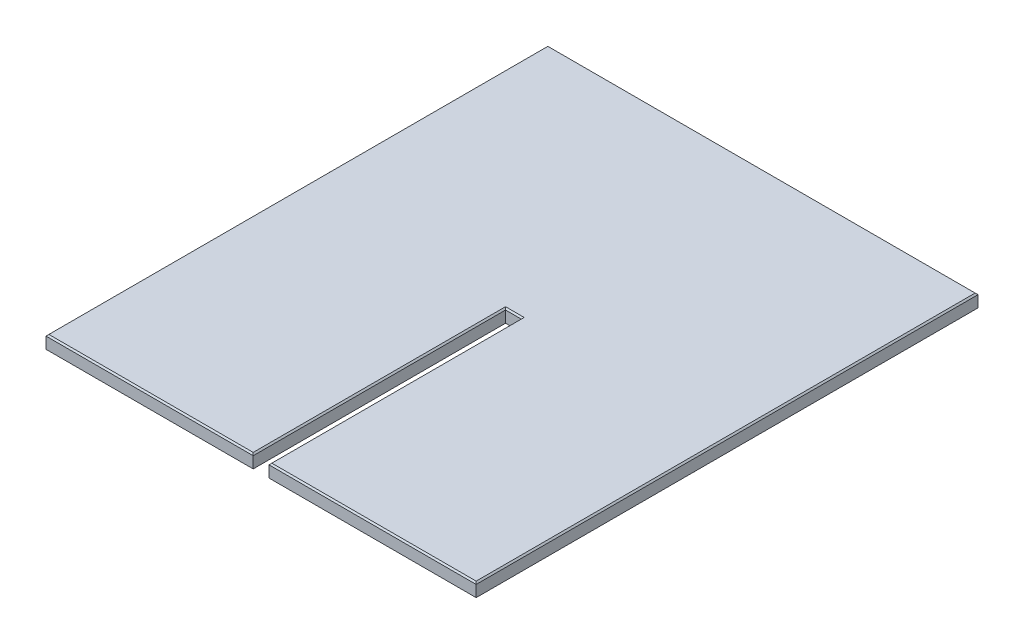
ISO-10303-21;
HEADER;
FILE_DESCRIPTION(('STEP AP214'),'2;1');
FILE_NAME('part.step','',(''),(''),'','','');
FILE_SCHEMA(('AUTOMOTIVE_DESIGN { 1 0 10303 214 1 1 1 1 }'));
ENDSEC;
DATA;
#1=APPLICATION_CONTEXT('core data for automotive mechanical design processes');
#2=APPLICATION_PROTOCOL_DEFINITION('international standard','automotive_design',2000,#1);
#3=PRODUCT_CONTEXT('',#1,'mechanical');
#4=PRODUCT('Part','Part','',(#3));
#5=PRODUCT_RELATED_PRODUCT_CATEGORY('part','',(#4));
#6=PRODUCT_DEFINITION_FORMATION('','',#4);
#7=PRODUCT_DEFINITION_CONTEXT('part definition',#1,'design');
#8=PRODUCT_DEFINITION('design','',#6,#7);
#9=PRODUCT_DEFINITION_SHAPE('','',#8);
#10=(LENGTH_UNIT() NAMED_UNIT(*) SI_UNIT(.MILLI.,.METRE.));
#11=(NAMED_UNIT(*) PLANE_ANGLE_UNIT() SI_UNIT($,.RADIAN.));
#12=(NAMED_UNIT(*) SI_UNIT($,.STERADIAN.) SOLID_ANGLE_UNIT());
#13=UNCERTAINTY_MEASURE_WITH_UNIT(LENGTH_MEASURE(1.E-05),#10,'distance_accuracy_value','');
#14=(GEOMETRIC_REPRESENTATION_CONTEXT(3) GLOBAL_UNCERTAINTY_ASSIGNED_CONTEXT((#13)) GLOBAL_UNIT_ASSIGNED_CONTEXT((#10,
#11,#12)) REPRESENTATION_CONTEXT('',''));
#15=CARTESIAN_POINT('',(0.,0.,0.));
#16=DIRECTION('',(0.,0.,1.));
#17=DIRECTION('',(1.,0.,0.));
#18=AXIS2_PLACEMENT_3D('',#15,#16,#17);
#19=CARTESIAN_POINT('',(-38.1,1.27,44.45));
#20=DIRECTION('',(0.,0.,-1.));
#21=DIRECTION('',(-1.,0.,0.));
#22=AXIS2_PLACEMENT_3D('',#19,#20,#21);
#23=PLANE('',#22);
#24=DIRECTION('',(0.,-1.,0.));
#25=VECTOR('',#24,1.);
#26=CARTESIAN_POINT('',(-38.1,1.27,44.45));
#27=LINE('',#26,#25);
#28=CARTESIAN_POINT('',(-38.1,1.01599999999998,44.45));
#29=VERTEX_POINT('',#28);
#30=CARTESIAN_POINT('',(-38.1,-1.01600000000001,44.45));
#31=VERTEX_POINT('',#30);
#32=EDGE_CURVE('E169',#29,#31,#27,.T.);
#33=ORIENTED_EDGE('',*,*,#32,.T.);
#34=DIRECTION('',(1.,0.,0.));
#35=VECTOR('',#34,1.);
#36=CARTESIAN_POINT('',(-1.39699999999999,-1.01600000000001,44.45));
#37=LINE('',#36,#35);
#38=CARTESIAN_POINT('',(-1.39699999999999,-1.01600000000001,44.45));
#39=VERTEX_POINT('',#38);
#40=EDGE_CURVE('E282',#31,#39,#37,.T.);
#41=ORIENTED_EDGE('',*,*,#40,.T.);
#42=DIRECTION('',(0.,-1.,0.));
#43=VECTOR('',#42,1.);
#44=CARTESIAN_POINT('',(-1.39699999999999,1.270012,44.45));
#45=LINE('',#44,#43);
#46=CARTESIAN_POINT('',(-1.39699999999999,1.01599999999998,44.45));
#47=VERTEX_POINT('',#46);
#48=EDGE_CURVE('E287',#47,#39,#45,.T.);
#49=ORIENTED_EDGE('',*,*,#48,.F.);
#50=DIRECTION('',(-1.,0.,0.));
#51=VECTOR('',#50,1.);
#52=CARTESIAN_POINT('',(-38.1,1.01599999999998,44.45));
#53=LINE('',#52,#51);
#54=EDGE_CURVE('E279',#47,#29,#53,.T.);
#55=ORIENTED_EDGE('',*,*,#54,.T.);
#56=EDGE_LOOP('',(#33,#41,#49,#55));
#57=FACE_BOUND('',#56,.T.);
#58=ADVANCED_FACE('F41',(#57),#23,.F.);
#59=CARTESIAN_POINT('',(0.,1.27,0.));
#60=DIRECTION('',(0.,-1.,0.));
#61=DIRECTION('',(0.,0.,-1.));
#62=AXIS2_PLACEMENT_3D('',#59,#60,#61);
#63=PLANE('',#62);
#64=DIRECTION('',(0.,0.,1.));
#65=VECTOR('',#64,1.);
#66=CARTESIAN_POINT('',(-37.846,1.27,0.));
#67=LINE('',#66,#65);
#68=CARTESIAN_POINT('',(-37.846,1.27,-44.196));
#69=VERTEX_POINT('',#68);
#70=CARTESIAN_POINT('',(-37.846,1.27,44.196));
#71=VERTEX_POINT('',#70);
#72=EDGE_CURVE('E51',#69,#71,#67,.T.);
#73=ORIENTED_EDGE('',*,*,#72,.T.);
#74=DIRECTION('',(1.,0.,0.));
#75=VECTOR('',#74,1.);
#76=CARTESIAN_POINT('',(0.,1.27,44.196));
#77=LINE('',#76,#75);
#78=CARTESIAN_POINT('',(-1.651,1.27,44.196));
#79=VERTEX_POINT('',#78);
#80=EDGE_CURVE('E11',#71,#79,#77,.T.);
#81=ORIENTED_EDGE('',*,*,#80,.T.);
#82=DIRECTION('',(0.,0.,-1.));
#83=VECTOR('',#82,1.);
#84=CARTESIAN_POINT('',(-1.651,1.27,-0.254));
#85=LINE('',#84,#83);
#86=CARTESIAN_POINT('',(-1.651,1.27,-0.508000000000004));
#87=VERTEX_POINT('',#86);
#88=EDGE_CURVE('E198',#79,#87,#85,.T.);
#89=ORIENTED_EDGE('',*,*,#88,.T.);
#90=DIRECTION('',(1.,0.,0.));
#91=VECTOR('',#90,1.);
#92=CARTESIAN_POINT('',(0.,1.27,-0.508000000000004));
#93=LINE('',#92,#91);
#94=CARTESIAN_POINT('',(1.651,1.27,-0.508000000000004));
#95=VERTEX_POINT('',#94);
#96=EDGE_CURVE('E205',#87,#95,#93,.T.);
#97=ORIENTED_EDGE('',*,*,#96,.T.);
#98=DIRECTION('',(0.,0.,1.));
#99=VECTOR('',#98,1.);
#100=CARTESIAN_POINT('',(1.651,1.27,0.));
#101=LINE('',#100,#99);
#102=CARTESIAN_POINT('',(1.65100000000001,1.27,44.196));
#103=VERTEX_POINT('',#102);
#104=EDGE_CURVE('E185',#95,#103,#101,.T.);
#105=ORIENTED_EDGE('',*,*,#104,.T.);
#106=DIRECTION('',(1.,0.,0.));
#107=VECTOR('',#106,1.);
#108=CARTESIAN_POINT('',(0.,1.27,44.196));
#109=LINE('',#108,#107);
#110=CARTESIAN_POINT('',(37.846,1.27,44.196));
#111=VERTEX_POINT('',#110);
#112=EDGE_CURVE('E208',#103,#111,#109,.T.);
#113=ORIENTED_EDGE('',*,*,#112,.T.);
#114=DIRECTION('',(0.,0.,-1.));
#115=VECTOR('',#114,1.);
#116=CARTESIAN_POINT('',(37.846,1.27,0.));
#117=LINE('',#116,#115);
#118=CARTESIAN_POINT('',(37.846,1.27,-44.196));
#119=VERTEX_POINT('',#118);
#120=EDGE_CURVE('E210',#111,#119,#117,.T.);
#121=ORIENTED_EDGE('',*,*,#120,.T.);
#122=DIRECTION('',(-1.,0.,0.));
#123=VECTOR('',#122,1.);
#124=CARTESIAN_POINT('',(0.,1.27,-44.196));
#125=LINE('',#124,#123);
#126=EDGE_CURVE('E62',#119,#69,#125,.T.);
#127=ORIENTED_EDGE('',*,*,#126,.T.);
#128=EDGE_LOOP('',(#73,#81,#89,#97,#105,#113,#121,#127));
#129=FACE_BOUND('',#128,.T.);
#130=ADVANCED_FACE('F304',(#129),#63,.F.);
#131=CARTESIAN_POINT('',(0.,-1.27,0.));
#132=DIRECTION('',(0.,-1.,0.));
#133=DIRECTION('',(0.,0.,-1.));
#134=AXIS2_PLACEMENT_3D('',#131,#132,#133);
#135=PLANE('',#134);
#136=DIRECTION('',(-1.,0.,0.));
#137=VECTOR('',#136,1.);
#138=CARTESIAN_POINT('',(1.39700000000001,-1.27,44.196));
#139=LINE('',#138,#137);
#140=CARTESIAN_POINT('',(37.846,-1.27,44.196));
#141=VERTEX_POINT('',#140);
#142=CARTESIAN_POINT('',(1.651,-1.27,44.196));
#143=VERTEX_POINT('',#142);
#144=EDGE_CURVE('E264',#141,#143,#139,.T.);
#145=ORIENTED_EDGE('',*,*,#144,.T.);
#146=DIRECTION('',(0.,0.,-1.));
#147=VECTOR('',#146,1.);
#148=CARTESIAN_POINT('',(1.65099999999999,-1.27,-0.254));
#149=LINE('',#148,#147);
#150=CARTESIAN_POINT('',(1.65099999999999,-1.27,-0.50799999999999));
#151=VERTEX_POINT('',#150);
#152=EDGE_CURVE('E260',#143,#151,#149,.T.);
#153=ORIENTED_EDGE('',*,*,#152,.T.);
#154=DIRECTION('',(-1.,0.,0.));
#155=VECTOR('',#154,1.);
#156=CARTESIAN_POINT('',(-1.397,-1.27,-0.50799999999999));
#157=LINE('',#156,#155);
#158=CARTESIAN_POINT('',(-1.65099999999999,-1.27,-0.50799999999999));
#159=VERTEX_POINT('',#158);
#160=EDGE_CURVE('E657',#151,#159,#157,.T.);
#161=ORIENTED_EDGE('',*,*,#160,.T.);
#162=DIRECTION('',(0.,0.,1.));
#163=VECTOR('',#162,1.);
#164=CARTESIAN_POINT('',(-1.65099999999999,-1.27,0.));
#165=LINE('',#164,#163);
#166=CARTESIAN_POINT('',(-1.65099999999998,-1.27,44.196));
#167=VERTEX_POINT('',#166);
#168=EDGE_CURVE('E659',#159,#167,#165,.T.);
#169=ORIENTED_EDGE('',*,*,#168,.T.);
#170=DIRECTION('',(-1.,0.,0.));
#171=VECTOR('',#170,1.);
#172=CARTESIAN_POINT('',(-38.1,-1.27,44.196));
#173=LINE('',#172,#171);
#174=CARTESIAN_POINT('',(-37.846,-1.27,44.196));
#175=VERTEX_POINT('',#174);
#176=EDGE_CURVE('E661',#167,#175,#173,.T.);
#177=ORIENTED_EDGE('',*,*,#176,.T.);
#178=DIRECTION('',(0.,0.,-1.));
#179=VECTOR('',#178,1.);
#180=CARTESIAN_POINT('',(-37.846,-1.27,-44.45));
#181=LINE('',#180,#179);
#182=CARTESIAN_POINT('',(-37.846,-1.27,-44.196));
#183=VERTEX_POINT('',#182);
#184=EDGE_CURVE('E663',#175,#183,#181,.T.);
#185=ORIENTED_EDGE('',*,*,#184,.T.);
#186=DIRECTION('',(1.,0.,0.));
#187=VECTOR('',#186,1.);
#188=CARTESIAN_POINT('',(38.1,-1.27,-44.196));
#189=LINE('',#188,#187);
#190=CARTESIAN_POINT('',(37.846,-1.27,-44.196));
#191=VERTEX_POINT('',#190);
#192=EDGE_CURVE('E665',#183,#191,#189,.T.);
#193=ORIENTED_EDGE('',*,*,#192,.T.);
#194=DIRECTION('',(0.,0.,1.));
#195=VECTOR('',#194,1.);
#196=CARTESIAN_POINT('',(37.846,-1.27,44.45));
#197=LINE('',#196,#195);
#198=EDGE_CURVE('E667',#191,#141,#197,.T.);
#199=ORIENTED_EDGE('',*,*,#198,.T.);
#200=EDGE_LOOP('',(#145,#153,#161,#169,#177,#185,#193,#199));
#201=FACE_BOUND('',#200,.T.);
#202=ADVANCED_FACE('F306',(#201),#135,.T.);
#203=CARTESIAN_POINT('',(-38.1,1.27,44.45));
#204=DIRECTION('',(1.,0.,0.));
#205=DIRECTION('',(0.,0.,-1.));
#206=AXIS2_PLACEMENT_3D('',#203,#204,#205);
#207=PLANE('',#206);
#208=DIRECTION('',(0.,-1.,0.));
#209=VECTOR('',#208,1.);
#210=CARTESIAN_POINT('',(-38.1,1.27,-44.45));
#211=LINE('',#210,#209);
#212=CARTESIAN_POINT('',(-38.1,1.01599999999998,-44.45));
#213=VERTEX_POINT('',#212);
#214=CARTESIAN_POINT('',(-38.1,-1.01600000000001,-44.45));
#215=VERTEX_POINT('',#214);
#216=EDGE_CURVE('E296',#213,#215,#211,.T.);
#217=ORIENTED_EDGE('',*,*,#216,.T.);
#218=DIRECTION('',(0.,0.,1.));
#219=VECTOR('',#218,1.);
#220=CARTESIAN_POINT('',(-38.1,-1.01600000000001,44.45));
#221=LINE('',#220,#219);
#222=EDGE_CURVE('E277',#215,#31,#221,.T.);
#223=ORIENTED_EDGE('',*,*,#222,.T.);
#224=ORIENTED_EDGE('',*,*,#32,.F.);
#225=DIRECTION('',(0.,0.,-1.));
#226=VECTOR('',#225,1.);
#227=CARTESIAN_POINT('',(-38.1,1.01599999999998,44.45));
#228=LINE('',#227,#226);
#229=EDGE_CURVE('E275',#29,#213,#228,.T.);
#230=ORIENTED_EDGE('',*,*,#229,.T.);
#231=EDGE_LOOP('',(#217,#223,#224,#230));
#232=FACE_BOUND('',#231,.T.);
#233=ADVANCED_FACE('F312',(#232),#207,.F.);
#234=DIRECTION('',(0.,-1.,0.));
#235=VECTOR('',#234,1.);
#236=CARTESIAN_POINT('',(1.39700000000001,1.270012,44.45));
#237=LINE('',#236,#235);
#238=CARTESIAN_POINT('',(1.39700000000001,1.01599999999998,44.45));
#239=VERTEX_POINT('',#238);
#240=CARTESIAN_POINT('',(1.39700000000001,-1.01600000000001,44.45));
#241=VERTEX_POINT('',#240);
#242=EDGE_CURVE('E163',#239,#241,#237,.T.);
#243=ORIENTED_EDGE('',*,*,#242,.T.);
#244=DIRECTION('',(1.,0.,0.));
#245=VECTOR('',#244,1.);
#246=CARTESIAN_POINT('',(38.1,-1.01600000000001,44.45));
#247=LINE('',#246,#245);
#248=CARTESIAN_POINT('',(38.1,-1.01600000000001,44.45));
#249=VERTEX_POINT('',#248);
#250=EDGE_CURVE('E259',#241,#249,#247,.T.);
#251=ORIENTED_EDGE('',*,*,#250,.T.);
#252=DIRECTION('',(0.,-1.,0.));
#253=VECTOR('',#252,1.);
#254=CARTESIAN_POINT('',(38.1,1.27,44.45));
#255=LINE('',#254,#253);
#256=CARTESIAN_POINT('',(38.1,1.01599999999998,44.45));
#257=VERTEX_POINT('',#256);
#258=EDGE_CURVE('E649',#257,#249,#255,.T.);
#259=ORIENTED_EDGE('',*,*,#258,.F.);
#260=DIRECTION('',(-1.,0.,0.));
#261=VECTOR('',#260,1.);
#262=CARTESIAN_POINT('',(-38.1,1.01599999999998,44.45));
#263=LINE('',#262,#261);
#264=EDGE_CURVE('E256',#257,#239,#263,.T.);
#265=ORIENTED_EDGE('',*,*,#264,.T.);
#266=EDGE_LOOP('',(#243,#251,#259,#265));
#267=FACE_BOUND('',#266,.T.);
#268=ADVANCED_FACE('F316',(#267),#23,.F.);
#269=CARTESIAN_POINT('',(38.1,1.27,44.45));
#270=DIRECTION('',(-1.,0.,0.));
#271=DIRECTION('',(0.,0.,1.));
#272=AXIS2_PLACEMENT_3D('',#269,#270,#271);
#273=PLANE('',#272);
#274=ORIENTED_EDGE('',*,*,#258,.T.);
#275=DIRECTION('',(0.,0.,-1.));
#276=VECTOR('',#275,1.);
#277=CARTESIAN_POINT('',(38.1,-1.01600000000001,-44.45));
#278=LINE('',#277,#276);
#279=CARTESIAN_POINT('',(38.1,-1.01600000000001,-44.45));
#280=VERTEX_POINT('',#279);
#281=EDGE_CURVE('E269',#249,#280,#278,.T.);
#282=ORIENTED_EDGE('',*,*,#281,.T.);
#283=DIRECTION('',(0.,-1.,0.));
#284=VECTOR('',#283,1.);
#285=CARTESIAN_POINT('',(38.1,1.27,-44.45));
#286=LINE('',#285,#284);
#287=CARTESIAN_POINT('',(38.1,1.01599999999998,-44.45));
#288=VERTEX_POINT('',#287);
#289=EDGE_CURVE('E647',#288,#280,#286,.T.);
#290=ORIENTED_EDGE('',*,*,#289,.F.);
#291=DIRECTION('',(0.,0.,1.));
#292=VECTOR('',#291,1.);
#293=CARTESIAN_POINT('',(38.1,1.01599999999998,44.45));
#294=LINE('',#293,#292);
#295=EDGE_CURVE('E252',#288,#257,#294,.T.);
#296=ORIENTED_EDGE('',*,*,#295,.T.);
#297=EDGE_LOOP('',(#274,#282,#290,#296));
#298=FACE_BOUND('',#297,.T.);
#299=ADVANCED_FACE('F323',(#298),#273,.F.);
#300=CARTESIAN_POINT('',(-38.1,1.27,-44.45));
#301=DIRECTION('',(0.,0.,1.));
#302=DIRECTION('',(1.,0.,0.));
#303=AXIS2_PLACEMENT_3D('',#300,#301,#302);
#304=PLANE('',#303);
#305=ORIENTED_EDGE('',*,*,#289,.T.);
#306=DIRECTION('',(-1.,0.,0.));
#307=VECTOR('',#306,1.);
#308=CARTESIAN_POINT('',(-38.1,-1.01600000000001,-44.45));
#309=LINE('',#308,#307);
#310=EDGE_CURVE('E273',#280,#215,#309,.T.);
#311=ORIENTED_EDGE('',*,*,#310,.T.);
#312=ORIENTED_EDGE('',*,*,#216,.F.);
#313=DIRECTION('',(1.,0.,0.));
#314=VECTOR('',#313,1.);
#315=CARTESIAN_POINT('',(-38.1,1.01599999999998,-44.45));
#316=LINE('',#315,#314);
#317=EDGE_CURVE('E271',#213,#288,#316,.T.);
#318=ORIENTED_EDGE('',*,*,#317,.T.);
#319=EDGE_LOOP('',(#305,#311,#312,#318));
#320=FACE_BOUND('',#319,.T.);
#321=ADVANCED_FACE('F320',(#320),#304,.F.);
#322=CARTESIAN_POINT('',(-1.397,1.270012,-0.254));
#323=DIRECTION('',(1.,0.,0.));
#324=DIRECTION('',(0.,0.,-1.));
#325=AXIS2_PLACEMENT_3D('',#322,#323,#324);
#326=PLANE('',#325);
#327=ORIENTED_EDGE('',*,*,#48,.T.);
#328=DIRECTION('',(0.,0.,-1.));
#329=VECTOR('',#328,1.);
#330=CARTESIAN_POINT('',(-1.397,-1.01600000000001,-0.254));
#331=LINE('',#330,#329);
#332=CARTESIAN_POINT('',(-1.397,-1.01600000000001,-0.254));
#333=VERTEX_POINT('',#332);
#334=EDGE_CURVE('E196',#39,#333,#331,.T.);
#335=ORIENTED_EDGE('',*,*,#334,.T.);
#336=DIRECTION('',(0.,-1.,0.));
#337=VECTOR('',#336,1.);
#338=CARTESIAN_POINT('',(-1.397,1.270012,-0.254));
#339=LINE('',#338,#337);
#340=CARTESIAN_POINT('',(-1.397,1.01599999999998,-0.254));
#341=VERTEX_POINT('',#340);
#342=EDGE_CURVE('E179',#341,#333,#339,.T.);
#343=ORIENTED_EDGE('',*,*,#342,.F.);
#344=DIRECTION('',(0.,0.,1.));
#345=VECTOR('',#344,1.);
#346=CARTESIAN_POINT('',(-1.39699999999999,1.01599999999998,44.45));
#347=LINE('',#346,#345);
#348=EDGE_CURVE('E200',#341,#47,#347,.T.);
#349=ORIENTED_EDGE('',*,*,#348,.T.);
#350=EDGE_LOOP('',(#327,#335,#343,#349));
#351=FACE_BOUND('',#350,.T.);
#352=ADVANCED_FACE('F286',(#351),#326,.T.);
#353=CARTESIAN_POINT('',(1.397,1.270012,-0.254));
#354=DIRECTION('',(1.,0.,0.));
#355=DIRECTION('',(0.,0.,-1.));
#356=AXIS2_PLACEMENT_3D('',#353,#354,#355);
#357=PLANE('',#356);
#358=DIRECTION('',(0.,-1.,0.));
#359=VECTOR('',#358,1.);
#360=CARTESIAN_POINT('',(1.397,1.270012,-0.254));
#361=LINE('',#360,#359);
#362=CARTESIAN_POINT('',(1.397,1.01599999999998,-0.254));
#363=VERTEX_POINT('',#362);
#364=CARTESIAN_POINT('',(1.397,-1.01600000000001,-0.254));
#365=VERTEX_POINT('',#364);
#366=EDGE_CURVE('E160',#363,#365,#361,.T.);
#367=ORIENTED_EDGE('',*,*,#366,.T.);
#368=DIRECTION('',(0.,0.,1.));
#369=VECTOR('',#368,1.);
#370=CARTESIAN_POINT('',(1.39700000000001,-1.01600000000001,44.45));
#371=LINE('',#370,#369);
#372=EDGE_CURVE('E168',#365,#241,#371,.T.);
#373=ORIENTED_EDGE('',*,*,#372,.T.);
#374=ORIENTED_EDGE('',*,*,#242,.F.);
#375=DIRECTION('',(0.,0.,-1.));
#376=VECTOR('',#375,1.);
#377=CARTESIAN_POINT('',(1.397,1.01599999999998,-0.254));
#378=LINE('',#377,#376);
#379=EDGE_CURVE('E156',#239,#363,#378,.T.);
#380=ORIENTED_EDGE('',*,*,#379,.T.);
#381=EDGE_LOOP('',(#367,#373,#374,#380));
#382=FACE_BOUND('',#381,.T.);
#383=ADVANCED_FACE('F158',(#382),#357,.F.);
#384=CARTESIAN_POINT('',(-1.397,1.270012,-0.254));
#385=DIRECTION('',(0.,0.,-1.));
#386=DIRECTION('',(-1.,0.,0.));
#387=AXIS2_PLACEMENT_3D('',#384,#385,#386);
#388=PLANE('',#387);
#389=ORIENTED_EDGE('',*,*,#342,.T.);
#390=DIRECTION('',(1.,0.,0.));
#391=VECTOR('',#390,1.);
#392=CARTESIAN_POINT('',(1.397,-1.01600000000001,-0.254));
#393=LINE('',#392,#391);
#394=EDGE_CURVE('E178',#333,#365,#393,.T.);
#395=ORIENTED_EDGE('',*,*,#394,.T.);
#396=ORIENTED_EDGE('',*,*,#366,.F.);
#397=DIRECTION('',(-1.,0.,0.));
#398=VECTOR('',#397,1.);
#399=CARTESIAN_POINT('',(-1.397,1.01599999999998,-0.254));
#400=LINE('',#399,#398);
#401=EDGE_CURVE('E175',#363,#341,#400,.T.);
#402=ORIENTED_EDGE('',*,*,#401,.T.);
#403=EDGE_LOOP('',(#389,#395,#396,#402));
#404=FACE_BOUND('',#403,.T.);
#405=ADVANCED_FACE('F173',(#404),#388,.F.);
#406=CARTESIAN_POINT('',(-38.1,-1.01600000000001,44.45));
#407=DIRECTION('',(-0.707106781186547,-0.707106781186547,0.));
#408=DIRECTION('',(0.,0.,-1.));
#409=AXIS2_PLACEMENT_3D('',#406,#407,#408);
#410=PLANE('',#409);
#411=DIRECTION('',(0.577350269189626,-0.577350269189626,0.577350269189626));
#412=VECTOR('',#411,1.);
#413=CARTESIAN_POINT('',(-8.46666666666667,-30.6493333333333,-14.8166666666667));
#414=LINE('',#413,#412);
#415=EDGE_CURVE('E230',#183,#215,#414,.F.);
#416=ORIENTED_EDGE('',*,*,#415,.F.);
#417=ORIENTED_EDGE('',*,*,#184,.F.);
#418=DIRECTION('',(0.577350269189626,-0.577350269189626,-0.577350269189626));
#419=VECTOR('',#418,1.);
#420=CARTESIAN_POINT('',(-38.1,-1.01600000000001,44.45));
#421=LINE('',#420,#419);
#422=EDGE_CURVE('E233',#31,#175,#421,.T.);
#423=ORIENTED_EDGE('',*,*,#422,.F.);
#424=ORIENTED_EDGE('',*,*,#222,.F.);
#425=EDGE_LOOP('',(#416,#417,#423,#424));
#426=FACE_BOUND('',#425,.T.);
#427=ADVANCED_FACE('F381',(#426),#410,.T.);
#428=CARTESIAN_POINT('',(-38.1,-1.01600000000001,44.45));
#429=DIRECTION('',(0.,-0.707106781186547,0.707106781186547));
#430=DIRECTION('',(-1.,0.,0.));
#431=AXIS2_PLACEMENT_3D('',#428,#429,#430);
#432=PLANE('',#431);
#433=ORIENTED_EDGE('',*,*,#422,.T.);
#434=ORIENTED_EDGE('',*,*,#176,.F.);
#435=DIRECTION('',(0.577350269189626,0.577350269189626,0.577350269189626));
#436=VECTOR('',#435,1.);
#437=CARTESIAN_POINT('',(-16.383,-16.002,29.464));
#438=LINE('',#437,#436);
#439=EDGE_CURVE('E227',#39,#167,#438,.F.);
#440=ORIENTED_EDGE('',*,*,#439,.F.);
#441=ORIENTED_EDGE('',*,*,#40,.F.);
#442=EDGE_LOOP('',(#433,#434,#440,#441));
#443=FACE_BOUND('',#442,.T.);
#444=ADVANCED_FACE('F374',(#443),#432,.T.);
#445=CARTESIAN_POINT('',(-38.1,-1.01600000000001,-44.45));
#446=DIRECTION('',(0.,-0.707106781186547,-0.707106781186547));
#447=DIRECTION('',(1.,0.,0.));
#448=AXIS2_PLACEMENT_3D('',#445,#446,#447);
#449=PLANE('',#448);
#450=ORIENTED_EDGE('',*,*,#415,.T.);
#451=ORIENTED_EDGE('',*,*,#310,.F.);
#452=DIRECTION('',(-0.577350269189626,-0.577350269189626,0.577350269189626));
#453=VECTOR('',#452,1.);
#454=CARTESIAN_POINT('',(12.7,-26.416,-19.05));
#455=LINE('',#454,#453);
#456=EDGE_CURVE('E224',#191,#280,#455,.F.);
#457=ORIENTED_EDGE('',*,*,#456,.F.);
#458=ORIENTED_EDGE('',*,*,#192,.F.);
#459=EDGE_LOOP('',(#450,#451,#457,#458));
#460=FACE_BOUND('',#459,.T.);
#461=ADVANCED_FACE('F367',(#460),#449,.T.);
#462=CARTESIAN_POINT('',(-1.65099999999999,-1.27,0.));
#463=DIRECTION('',(-0.707106781186547,0.707106781186548,0.));
#464=DIRECTION('',(0.,0.,1.));
#465=AXIS2_PLACEMENT_3D('',#462,#463,#464);
#466=PLANE('',#465);
#467=ORIENTED_EDGE('',*,*,#439,.T.);
#468=ORIENTED_EDGE('',*,*,#168,.F.);
#469=DIRECTION('',(0.577350269189626,0.577350269189626,0.577350269189626));
#470=VECTOR('',#469,1.);
#471=CARTESIAN_POINT('',(-1.48166666666666,-1.10066666666667,-0.33866666666666));
#472=LINE('',#471,#470);
#473=EDGE_CURVE('E221',#333,#159,#472,.F.);
#474=ORIENTED_EDGE('',*,*,#473,.F.);
#475=ORIENTED_EDGE('',*,*,#334,.F.);
#476=EDGE_LOOP('',(#467,#468,#474,#475));
#477=FACE_BOUND('',#476,.T.);
#478=ADVANCED_FACE('F360',(#477),#466,.F.);
#479=CARTESIAN_POINT('',(38.1,-1.01600000000001,44.45));
#480=DIRECTION('',(0.707106781186547,-0.707106781186547,0.));
#481=DIRECTION('',(0.,0.,1.));
#482=AXIS2_PLACEMENT_3D('',#479,#480,#481);
#483=PLANE('',#482);
#484=ORIENTED_EDGE('',*,*,#456,.T.);
#485=ORIENTED_EDGE('',*,*,#281,.F.);
#486=DIRECTION('',(-0.577350269189626,-0.577350269189626,-0.577350269189626));
#487=VECTOR('',#486,1.);
#488=CARTESIAN_POINT('',(38.1,-1.01600000000001,44.45));
#489=LINE('',#488,#487);
#490=EDGE_CURVE('E218',#141,#249,#489,.F.);
#491=ORIENTED_EDGE('',*,*,#490,.F.);
#492=ORIENTED_EDGE('',*,*,#198,.F.);
#493=EDGE_LOOP('',(#484,#485,#491,#492));
#494=FACE_BOUND('',#493,.T.);
#495=ADVANCED_FACE('F353',(#494),#483,.T.);
#496=CARTESIAN_POINT('',(-1.397,-1.01600000000001,-0.254));
#497=DIRECTION('',(0.,-0.707106781186548,0.707106781186547));
#498=DIRECTION('',(-1.,0.,0.));
#499=AXIS2_PLACEMENT_3D('',#496,#497,#498);
#500=PLANE('',#499);
#501=ORIENTED_EDGE('',*,*,#473,.T.);
#502=ORIENTED_EDGE('',*,*,#160,.F.);
#503=DIRECTION('',(-0.577350269189626,0.577350269189626,0.577350269189626));
#504=VECTOR('',#503,1.);
#505=CARTESIAN_POINT('',(1.397,-1.01600000000001,-0.254));
#506=LINE('',#505,#504);
#507=EDGE_CURVE('E216',#365,#151,#506,.F.);
#508=ORIENTED_EDGE('',*,*,#507,.F.);
#509=ORIENTED_EDGE('',*,*,#394,.F.);
#510=EDGE_LOOP('',(#501,#502,#508,#509));
#511=FACE_BOUND('',#510,.T.);
#512=ADVANCED_FACE('F346',(#511),#500,.T.);
#513=CARTESIAN_POINT('',(-38.1,-1.01600000000001,44.45));
#514=DIRECTION('',(0.,-0.707106781186547,0.707106781186547));
#515=DIRECTION('',(-1.,0.,0.));
#516=AXIS2_PLACEMENT_3D('',#513,#514,#515);
#517=PLANE('',#516);
#518=ORIENTED_EDGE('',*,*,#490,.T.);
#519=ORIENTED_EDGE('',*,*,#250,.F.);
#520=DIRECTION('',(0.577350269189626,-0.577350269189626,-0.577350269189626));
#521=VECTOR('',#520,1.);
#522=CARTESIAN_POINT('',(-11.7686666666667,12.1496666666667,57.6156666666666));
#523=LINE('',#522,#521);
#524=EDGE_CURVE('E214',#143,#241,#523,.F.);
#525=ORIENTED_EDGE('',*,*,#524,.F.);
#526=ORIENTED_EDGE('',*,*,#144,.F.);
#527=EDGE_LOOP('',(#518,#519,#525,#526));
#528=FACE_BOUND('',#527,.T.);
#529=ADVANCED_FACE('F339',(#528),#517,.T.);
#530=CARTESIAN_POINT('',(1.397,-1.01600000000001,-0.254));
#531=DIRECTION('',(-0.707106781186547,-0.707106781186548,0.));
#532=DIRECTION('',(0.,0.,-1.));
#533=AXIS2_PLACEMENT_3D('',#530,#531,#532);
#534=PLANE('',#533);
#535=ORIENTED_EDGE('',*,*,#507,.T.);
#536=ORIENTED_EDGE('',*,*,#152,.F.);
#537=ORIENTED_EDGE('',*,*,#524,.T.);
#538=ORIENTED_EDGE('',*,*,#372,.F.);
#539=EDGE_LOOP('',(#535,#536,#537,#538));
#540=FACE_BOUND('',#539,.T.);
#541=ADVANCED_FACE('F333',(#540),#534,.T.);
#542=CARTESIAN_POINT('',(0.,1.27,44.196));
#543=DIRECTION('',(0.,-0.707106781186528,-0.707106781186567));
#544=DIRECTION('',(1.,0.,0.));
#545=AXIS2_PLACEMENT_3D('',#542,#543,#544);
#546=PLANE('',#545);
#547=DIRECTION('',(0.577350269189615,0.577350269189647,-0.577350269189615));
#548=VECTOR('',#547,1.);
#549=CARTESIAN_POINT('',(16.3829999999995,16.0020000000003,29.4640000000005));
#550=LINE('',#549,#548);
#551=EDGE_CURVE('E244',#239,#103,#550,.T.);
#552=ORIENTED_EDGE('',*,*,#551,.F.);
#553=ORIENTED_EDGE('',*,*,#264,.F.);
#554=DIRECTION('',(-0.577350269189615,0.577350269189647,-0.577350269189615));
#555=VECTOR('',#554,1.);
#556=CARTESIAN_POINT('',(25.2306666666671,13.8853333333336,31.5806666666671));
#557=LINE('',#556,#555);
#558=EDGE_CURVE('E46',#111,#257,#557,.F.);
#559=ORIENTED_EDGE('',*,*,#558,.F.);
#560=ORIENTED_EDGE('',*,*,#112,.F.);
#561=EDGE_LOOP('',(#552,#553,#559,#560));
#562=FACE_BOUND('',#561,.T.);
#563=ADVANCED_FACE('F44',(#562),#546,.F.);
#564=CARTESIAN_POINT('',(37.846,1.27,0.));
#565=DIRECTION('',(-0.707106781186567,-0.707106781186528,0.));
#566=DIRECTION('',(0.,0.,-1.));
#567=AXIS2_PLACEMENT_3D('',#564,#565,#566);
#568=PLANE('',#567);
#569=ORIENTED_EDGE('',*,*,#558,.T.);
#570=ORIENTED_EDGE('',*,*,#295,.F.);
#571=DIRECTION('',(-0.577350269189615,0.577350269189647,0.577350269189615));
#572=VECTOR('',#571,1.);
#573=CARTESIAN_POINT('',(23.1140000000005,16.0020000000003,-29.4640000000005));
#574=LINE('',#573,#572);
#575=EDGE_CURVE('E188',#119,#288,#574,.F.);
#576=ORIENTED_EDGE('',*,*,#575,.F.);
#577=ORIENTED_EDGE('',*,*,#120,.F.);
#578=EDGE_LOOP('',(#569,#570,#576,#577));
#579=FACE_BOUND('',#578,.T.);
#580=ADVANCED_FACE('F250',(#579),#568,.F.);
#581=CARTESIAN_POINT('',(1.651,1.27,0.));
#582=DIRECTION('',(0.707106781186567,-0.707106781186528,0.));
#583=DIRECTION('',(0.,0.,1.));
#584=AXIS2_PLACEMENT_3D('',#581,#582,#583);
#585=PLANE('',#584);
#586=ORIENTED_EDGE('',*,*,#551,.T.);
#587=ORIENTED_EDGE('',*,*,#104,.F.);
#588=DIRECTION('',(0.577350269189615,0.577350269189647,-0.577350269189615));
#589=VECTOR('',#588,1.);
#590=CARTESIAN_POINT('',(1.48166666666668,1.10066666666666,-0.338666666666676));
#591=LINE('',#590,#589);
#592=EDGE_CURVE('E183',#363,#95,#591,.T.);
#593=ORIENTED_EDGE('',*,*,#592,.F.);
#594=ORIENTED_EDGE('',*,*,#379,.F.);
#595=EDGE_LOOP('',(#586,#587,#593,#594));
#596=FACE_BOUND('',#595,.T.);
#597=ADVANCED_FACE('F184',(#596),#585,.F.);
#598=CARTESIAN_POINT('',(0.,1.27,-44.196));
#599=DIRECTION('',(0.,-0.707106781186528,0.707106781186567));
#600=DIRECTION('',(-1.,0.,0.));
#601=AXIS2_PLACEMENT_3D('',#598,#599,#600);
#602=PLANE('',#601);
#603=ORIENTED_EDGE('',*,*,#575,.T.);
#604=ORIENTED_EDGE('',*,*,#317,.F.);
#605=DIRECTION('',(0.577350269189615,0.577350269189647,0.577350269189615));
#606=VECTOR('',#605,1.);
#607=CARTESIAN_POINT('',(-25.2306666666671,13.8853333333336,-31.5806666666671));
#608=LINE('',#607,#606);
#609=EDGE_CURVE('E189',#69,#213,#608,.F.);
#610=ORIENTED_EDGE('',*,*,#609,.F.);
#611=ORIENTED_EDGE('',*,*,#126,.F.);
#612=EDGE_LOOP('',(#603,#604,#610,#611));
#613=FACE_BOUND('',#612,.T.);
#614=ADVANCED_FACE('F411',(#613),#602,.F.);
#615=CARTESIAN_POINT('',(0.,1.27,-0.508000000000004));
#616=DIRECTION('',(0.,-0.707106781186528,-0.707106781186567));
#617=DIRECTION('',(1.,0.,0.));
#618=AXIS2_PLACEMENT_3D('',#615,#616,#617);
#619=PLANE('',#618);
#620=ORIENTED_EDGE('',*,*,#592,.T.);
#621=ORIENTED_EDGE('',*,*,#96,.F.);
#622=DIRECTION('',(0.577350269189615,-0.577350269189647,0.577350269189615));
#623=VECTOR('',#622,1.);
#624=CARTESIAN_POINT('',(-1.10066666666669,0.719666666666655,0.0423333333333107));
#625=LINE('',#624,#623);
#626=EDGE_CURVE('E194',#341,#87,#625,.F.);
#627=ORIENTED_EDGE('',*,*,#626,.F.);
#628=ORIENTED_EDGE('',*,*,#401,.F.);
#629=EDGE_LOOP('',(#620,#621,#627,#628));
#630=FACE_BOUND('',#629,.T.);
#631=ADVANCED_FACE('F192',(#630),#619,.F.);
#632=CARTESIAN_POINT('',(-37.846,1.27,0.));
#633=DIRECTION('',(0.707106781186567,-0.707106781186528,0.));
#634=DIRECTION('',(0.,0.,1.));
#635=AXIS2_PLACEMENT_3D('',#632,#633,#634);
#636=PLANE('',#635);
#637=ORIENTED_EDGE('',*,*,#609,.T.);
#638=ORIENTED_EDGE('',*,*,#229,.F.);
#639=DIRECTION('',(0.577350269189615,0.577350269189647,-0.577350269189615));
#640=VECTOR('',#639,1.);
#641=CARTESIAN_POINT('',(-23.1140000000005,16.0020000000003,29.4640000000005));
#642=LINE('',#641,#640);
#643=EDGE_CURVE('E238',#71,#29,#642,.F.);
#644=ORIENTED_EDGE('',*,*,#643,.F.);
#645=ORIENTED_EDGE('',*,*,#72,.F.);
#646=EDGE_LOOP('',(#637,#638,#644,#645));
#647=FACE_BOUND('',#646,.T.);
#648=ADVANCED_FACE('F399',(#647),#636,.F.);
#649=CARTESIAN_POINT('',(-1.397,1.01599999999998,-0.254));
#650=DIRECTION('',(0.707106781186567,0.707106781186528,0.));
#651=DIRECTION('',(0.,0.,-1.));
#652=AXIS2_PLACEMENT_3D('',#649,#650,#651);
#653=PLANE('',#652);
#654=ORIENTED_EDGE('',*,*,#626,.T.);
#655=ORIENTED_EDGE('',*,*,#88,.F.);
#656=DIRECTION('',(-0.577350269189615,0.577350269189647,-0.577350269189615));
#657=VECTOR('',#656,1.);
#658=CARTESIAN_POINT('',(-16.2983333333328,15.9173333333336,29.5486666666672));
#659=LINE('',#658,#657);
#660=EDGE_CURVE('E236',#47,#79,#659,.T.);
#661=ORIENTED_EDGE('',*,*,#660,.F.);
#662=ORIENTED_EDGE('',*,*,#348,.F.);
#663=EDGE_LOOP('',(#654,#655,#661,#662));
#664=FACE_BOUND('',#663,.T.);
#665=ADVANCED_FACE('F303',(#664),#653,.T.);
#666=CARTESIAN_POINT('',(0.,1.27,44.196));
#667=DIRECTION('',(0.,-0.707106781186528,-0.707106781186567));
#668=DIRECTION('',(1.,0.,0.));
#669=AXIS2_PLACEMENT_3D('',#666,#667,#668);
#670=PLANE('',#669);
#671=ORIENTED_EDGE('',*,*,#643,.T.);
#672=ORIENTED_EDGE('',*,*,#54,.F.);
#673=ORIENTED_EDGE('',*,*,#660,.T.);
#674=ORIENTED_EDGE('',*,*,#80,.F.);
#675=EDGE_LOOP('',(#671,#672,#673,#674));
#676=FACE_BOUND('',#675,.T.);
#677=ADVANCED_FACE('F299',(#676),#670,.F.);
#678=CLOSED_SHELL('',(#58,#130,#202,#233,#268,#299,#321,#352,#383,#405,#427,#444,#461,#478,#495,
#512,#529,#541,#563,#580,#597,#614,#631,#648,#665,#677));
#679=MANIFOLD_SOLID_BREP('B2',#678);
#680=ADVANCED_BREP_SHAPE_REPRESENTATION('',(#18,#679),#14);
#681=SHAPE_DEFINITION_REPRESENTATION(#9,#680);
ENDSEC;
END-ISO-10303-21;
